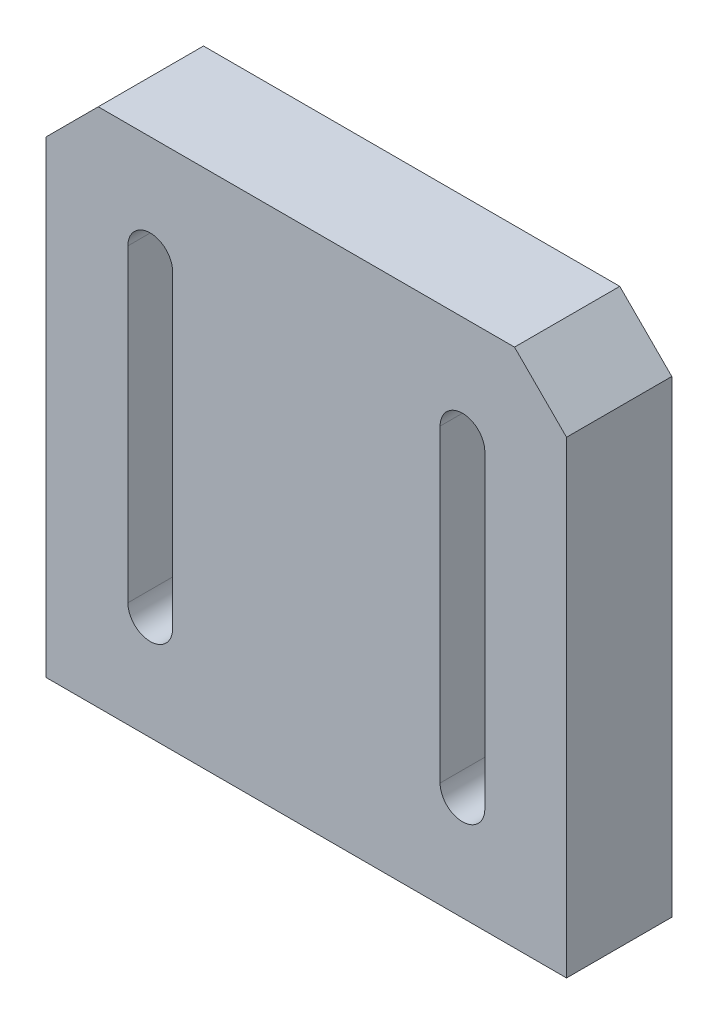
ISO-10303-21;
HEADER;
FILE_DESCRIPTION(('STEP AP214'),'2;1');
FILE_NAME('part.step','',(''),(''),'','','');
FILE_SCHEMA(('AUTOMOTIVE_DESIGN { 1 0 10303 214 1 1 1 1 }'));
ENDSEC;
DATA;
#1=APPLICATION_CONTEXT('core data for automotive mechanical design processes');
#2=APPLICATION_PROTOCOL_DEFINITION('international standard','automotive_design',2000,#1);
#3=PRODUCT_CONTEXT('',#1,'mechanical');
#4=PRODUCT('Part','Part','',(#3));
#5=PRODUCT_RELATED_PRODUCT_CATEGORY('part','',(#4));
#6=PRODUCT_DEFINITION_FORMATION('','',#4);
#7=PRODUCT_DEFINITION_CONTEXT('part definition',#1,'design');
#8=PRODUCT_DEFINITION('design','',#6,#7);
#9=PRODUCT_DEFINITION_SHAPE('','',#8);
#10=(LENGTH_UNIT() NAMED_UNIT(*) SI_UNIT(.MILLI.,.METRE.));
#11=(NAMED_UNIT(*) PLANE_ANGLE_UNIT() SI_UNIT($,.RADIAN.));
#12=(NAMED_UNIT(*) SI_UNIT($,.STERADIAN.) SOLID_ANGLE_UNIT());
#13=UNCERTAINTY_MEASURE_WITH_UNIT(LENGTH_MEASURE(1.E-05),#10,'distance_accuracy_value','');
#14=(GEOMETRIC_REPRESENTATION_CONTEXT(3) GLOBAL_UNCERTAINTY_ASSIGNED_CONTEXT((#13)) GLOBAL_UNIT_ASSIGNED_CONTEXT((#10,
#11,#12)) REPRESENTATION_CONTEXT('',''));
#15=CARTESIAN_POINT('',(0.,0.,0.));
#16=DIRECTION('',(0.,0.,1.));
#17=DIRECTION('',(1.,0.,0.));
#18=AXIS2_PLACEMENT_3D('',#15,#16,#17);
#19=CARTESIAN_POINT('',(0.,25.,0.));
#20=DIRECTION('',(0.,0.,1.));
#21=DIRECTION('',(1.,0.,0.));
#22=AXIS2_PLACEMENT_3D('',#19,#20,#21);
#23=PLANE('',#22);
#24=CARTESIAN_POINT('',(-15.,10.15,0.));
#25=DIRECTION('',(0.,0.,-1.));
#26=DIRECTION('',(-1.,0.,0.));
#27=AXIS2_PLACEMENT_3D('',#24,#25,#26);
#28=CIRCLE('',#27,2.15);
#29=CARTESIAN_POINT('',(-12.85,10.15,0.));
#30=VERTEX_POINT('',#29);
#31=CARTESIAN_POINT('',(-17.15,10.15,0.));
#32=VERTEX_POINT('',#31);
#33=EDGE_CURVE('E209',#30,#32,#28,.T.);
#34=ORIENTED_EDGE('',*,*,#33,.F.);
#35=DIRECTION('',(0.,-1.,0.));
#36=VECTOR('',#35,1.);
#37=CARTESIAN_POINT('',(-12.85,39.85,0.));
#38=LINE('',#37,#36);
#39=CARTESIAN_POINT('',(-12.85,39.85,0.));
#40=VERTEX_POINT('',#39);
#41=EDGE_CURVE('E183',#40,#30,#38,.T.);
#42=ORIENTED_EDGE('',*,*,#41,.F.);
#43=CARTESIAN_POINT('',(-15.,39.85,0.));
#44=DIRECTION('',(0.,0.,-1.));
#45=DIRECTION('',(1.,0.,0.));
#46=AXIS2_PLACEMENT_3D('',#43,#44,#45);
#47=CIRCLE('',#46,2.15);
#48=CARTESIAN_POINT('',(-17.15,39.85,0.));
#49=VERTEX_POINT('',#48);
#50=EDGE_CURVE('E162',#49,#40,#47,.T.);
#51=ORIENTED_EDGE('',*,*,#50,.F.);
#52=DIRECTION('',(0.,1.,0.));
#53=VECTOR('',#52,1.);
#54=CARTESIAN_POINT('',(-17.15,10.15,0.));
#55=LINE('',#54,#53);
#56=EDGE_CURVE('E190',#32,#49,#55,.T.);
#57=ORIENTED_EDGE('',*,*,#56,.F.);
#58=EDGE_LOOP('',(#34,#42,#51,#57));
#59=FACE_BOUND('',#58,.T.);
#60=CARTESIAN_POINT('',(15.,39.85,0.));
#61=DIRECTION('',(0.,0.,-1.));
#62=DIRECTION('',(1.,0.,0.));
#63=AXIS2_PLACEMENT_3D('',#60,#61,#62);
#64=CIRCLE('',#63,2.15);
#65=CARTESIAN_POINT('',(12.85,39.85,0.));
#66=VERTEX_POINT('',#65);
#67=CARTESIAN_POINT('',(17.15,39.85,0.));
#68=VERTEX_POINT('',#67);
#69=EDGE_CURVE('E204',#66,#68,#64,.T.);
#70=ORIENTED_EDGE('',*,*,#69,.F.);
#71=DIRECTION('',(0.,1.,0.));
#72=VECTOR('',#71,1.);
#73=CARTESIAN_POINT('',(12.85,10.15,0.));
#74=LINE('',#73,#72);
#75=CARTESIAN_POINT('',(12.85,10.15,0.));
#76=VERTEX_POINT('',#75);
#77=EDGE_CURVE('E207',#76,#66,#74,.T.);
#78=ORIENTED_EDGE('',*,*,#77,.F.);
#79=CARTESIAN_POINT('',(15.,10.15,0.));
#80=DIRECTION('',(0.,0.,-1.));
#81=DIRECTION('',(-1.,0.,0.));
#82=AXIS2_PLACEMENT_3D('',#79,#80,#81);
#83=CIRCLE('',#82,2.15);
#84=CARTESIAN_POINT('',(17.15,10.15,0.));
#85=VERTEX_POINT('',#84);
#86=EDGE_CURVE('E188',#85,#76,#83,.T.);
#87=ORIENTED_EDGE('',*,*,#86,.F.);
#88=DIRECTION('',(0.,-1.,0.));
#89=VECTOR('',#88,1.);
#90=CARTESIAN_POINT('',(17.15,39.85,0.));
#91=LINE('',#90,#89);
#92=EDGE_CURVE('E220',#68,#85,#91,.T.);
#93=ORIENTED_EDGE('',*,*,#92,.F.);
#94=EDGE_LOOP('',(#70,#78,#87,#93));
#95=FACE_BOUND('',#94,.T.);
#96=DIRECTION('',(-0.707106781186548,0.707106781186548,0.));
#97=VECTOR('',#96,1.);
#98=CARTESIAN_POINT('',(25.,45.,0.));
#99=LINE('',#98,#97);
#100=CARTESIAN_POINT('',(25.,45.,0.));
#101=VERTEX_POINT('',#100);
#102=CARTESIAN_POINT('',(20.,50.,0.));
#103=VERTEX_POINT('',#102);
#104=EDGE_CURVE('E25',#101,#103,#99,.T.);
#105=ORIENTED_EDGE('',*,*,#104,.F.);
#106=DIRECTION('',(0.,1.,0.));
#107=VECTOR('',#106,1.);
#108=CARTESIAN_POINT('',(25.,0.,0.));
#109=LINE('',#108,#107);
#110=CARTESIAN_POINT('',(25.,0.,0.));
#111=VERTEX_POINT('',#110);
#112=EDGE_CURVE('E246',#111,#101,#109,.T.);
#113=ORIENTED_EDGE('',*,*,#112,.F.);
#114=DIRECTION('',(1.,0.,0.));
#115=VECTOR('',#114,1.);
#116=CARTESIAN_POINT('',(-25.,0.,0.));
#117=LINE('',#116,#115);
#118=CARTESIAN_POINT('',(-25.,0.,0.));
#119=VERTEX_POINT('',#118);
#120=EDGE_CURVE('E263',#119,#111,#117,.T.);
#121=ORIENTED_EDGE('',*,*,#120,.F.);
#122=DIRECTION('',(0.,-1.,0.));
#123=VECTOR('',#122,1.);
#124=CARTESIAN_POINT('',(-25.,45.,0.));
#125=LINE('',#124,#123);
#126=CARTESIAN_POINT('',(-25.,45.,0.));
#127=VERTEX_POINT('',#126);
#128=EDGE_CURVE('E272',#127,#119,#125,.T.);
#129=ORIENTED_EDGE('',*,*,#128,.F.);
#130=DIRECTION('',(-0.707106781186548,-0.707106781186548,0.));
#131=VECTOR('',#130,1.);
#132=CARTESIAN_POINT('',(-20.,50.,0.));
#133=LINE('',#132,#131);
#134=CARTESIAN_POINT('',(-20.,50.,0.));
#135=VERTEX_POINT('',#134);
#136=EDGE_CURVE('E281',#135,#127,#133,.T.);
#137=ORIENTED_EDGE('',*,*,#136,.F.);
#138=DIRECTION('',(-1.,0.,0.));
#139=VECTOR('',#138,1.);
#140=CARTESIAN_POINT('',(20.,50.,0.));
#141=LINE('',#140,#139);
#142=EDGE_CURVE('E200',#103,#135,#141,.T.);
#143=ORIENTED_EDGE('',*,*,#142,.F.);
#144=EDGE_LOOP('',(#105,#113,#121,#129,#137,#143));
#145=FACE_BOUND('',#144,.T.);
#146=ADVANCED_FACE('F16',(#59,#95,#145),#23,.F.);
#147=CARTESIAN_POINT('',(0.,25.,10.114));
#148=DIRECTION('',(0.,0.,1.));
#149=DIRECTION('',(1.,0.,0.));
#150=AXIS2_PLACEMENT_3D('',#147,#148,#149);
#151=PLANE('',#150);
#152=CARTESIAN_POINT('',(-15.,10.15,10.114));
#153=DIRECTION('',(0.,0.,-1.));
#154=DIRECTION('',(-1.,0.,0.));
#155=AXIS2_PLACEMENT_3D('',#152,#153,#154);
#156=CIRCLE('',#155,2.15);
#157=CARTESIAN_POINT('',(-12.85,10.15,10.114));
#158=VERTEX_POINT('',#157);
#159=CARTESIAN_POINT('',(-17.15,10.15,10.114));
#160=VERTEX_POINT('',#159);
#161=EDGE_CURVE('E206',#158,#160,#156,.T.);
#162=ORIENTED_EDGE('',*,*,#161,.T.);
#163=DIRECTION('',(0.,1.,0.));
#164=VECTOR('',#163,1.);
#165=CARTESIAN_POINT('',(-17.15,10.15,10.114));
#166=LINE('',#165,#164);
#167=CARTESIAN_POINT('',(-17.15,39.85,10.114));
#168=VERTEX_POINT('',#167);
#169=EDGE_CURVE('E160',#160,#168,#166,.T.);
#170=ORIENTED_EDGE('',*,*,#169,.T.);
#171=CARTESIAN_POINT('',(-15.,39.85,10.114));
#172=DIRECTION('',(0.,0.,-1.));
#173=DIRECTION('',(1.,0.,0.));
#174=AXIS2_PLACEMENT_3D('',#171,#172,#173);
#175=CIRCLE('',#174,2.15);
#176=CARTESIAN_POINT('',(-12.85,39.85,10.114));
#177=VERTEX_POINT('',#176);
#178=EDGE_CURVE('E149',#168,#177,#175,.T.);
#179=ORIENTED_EDGE('',*,*,#178,.T.);
#180=DIRECTION('',(0.,-1.,0.));
#181=VECTOR('',#180,1.);
#182=CARTESIAN_POINT('',(-12.85,39.85,10.114));
#183=LINE('',#182,#181);
#184=EDGE_CURVE('E152',#177,#158,#183,.T.);
#185=ORIENTED_EDGE('',*,*,#184,.T.);
#186=EDGE_LOOP('',(#162,#170,#179,#185));
#187=FACE_BOUND('',#186,.T.);
#188=CARTESIAN_POINT('',(15.,39.85,10.114));
#189=DIRECTION('',(0.,0.,-1.));
#190=DIRECTION('',(1.,0.,0.));
#191=AXIS2_PLACEMENT_3D('',#188,#189,#190);
#192=CIRCLE('',#191,2.15);
#193=CARTESIAN_POINT('',(12.85,39.85,10.114));
#194=VERTEX_POINT('',#193);
#195=CARTESIAN_POINT('',(17.15,39.85,10.114));
#196=VERTEX_POINT('',#195);
#197=EDGE_CURVE('E242',#194,#196,#192,.T.);
#198=ORIENTED_EDGE('',*,*,#197,.T.);
#199=DIRECTION('',(0.,-1.,0.));
#200=VECTOR('',#199,1.);
#201=CARTESIAN_POINT('',(17.15,39.85,10.114));
#202=LINE('',#201,#200);
#203=CARTESIAN_POINT('',(17.15,10.15,10.114));
#204=VERTEX_POINT('',#203);
#205=EDGE_CURVE('E202',#196,#204,#202,.T.);
#206=ORIENTED_EDGE('',*,*,#205,.T.);
#207=CARTESIAN_POINT('',(15.,10.15,10.114));
#208=DIRECTION('',(0.,0.,-1.));
#209=DIRECTION('',(-1.,0.,0.));
#210=AXIS2_PLACEMENT_3D('',#207,#208,#209);
#211=CIRCLE('',#210,2.15);
#212=CARTESIAN_POINT('',(12.85,10.15,10.114));
#213=VERTEX_POINT('',#212);
#214=EDGE_CURVE('E189',#204,#213,#211,.T.);
#215=ORIENTED_EDGE('',*,*,#214,.T.);
#216=DIRECTION('',(0.,1.,0.));
#217=VECTOR('',#216,1.);
#218=CARTESIAN_POINT('',(12.85,10.15,10.114));
#219=LINE('',#218,#217);
#220=EDGE_CURVE('E240',#213,#194,#219,.T.);
#221=ORIENTED_EDGE('',*,*,#220,.T.);
#222=EDGE_LOOP('',(#198,#206,#215,#221));
#223=FACE_BOUND('',#222,.T.);
#224=DIRECTION('',(-0.707106781186548,0.707106781186548,0.));
#225=VECTOR('',#224,1.);
#226=CARTESIAN_POINT('',(25.,45.,10.114));
#227=LINE('',#226,#225);
#228=CARTESIAN_POINT('',(25.,45.,10.114));
#229=VERTEX_POINT('',#228);
#230=CARTESIAN_POINT('',(20.,50.,10.114));
#231=VERTEX_POINT('',#230);
#232=EDGE_CURVE('E11',#229,#231,#227,.T.);
#233=ORIENTED_EDGE('',*,*,#232,.T.);
#234=DIRECTION('',(-1.,0.,0.));
#235=VECTOR('',#234,1.);
#236=CARTESIAN_POINT('',(20.,50.,10.114));
#237=LINE('',#236,#235);
#238=CARTESIAN_POINT('',(-20.,50.,10.114));
#239=VERTEX_POINT('',#238);
#240=EDGE_CURVE('E194',#231,#239,#237,.T.);
#241=ORIENTED_EDGE('',*,*,#240,.T.);
#242=DIRECTION('',(-0.707106781186548,-0.707106781186548,0.));
#243=VECTOR('',#242,1.);
#244=CARTESIAN_POINT('',(-20.,50.,10.114));
#245=LINE('',#244,#243);
#246=CARTESIAN_POINT('',(-25.,45.,10.114));
#247=VERTEX_POINT('',#246);
#248=EDGE_CURVE('E283',#239,#247,#245,.T.);
#249=ORIENTED_EDGE('',*,*,#248,.T.);
#250=DIRECTION('',(0.,-1.,0.));
#251=VECTOR('',#250,1.);
#252=CARTESIAN_POINT('',(-25.,45.,10.114));
#253=LINE('',#252,#251);
#254=CARTESIAN_POINT('',(-25.,0.,10.114));
#255=VERTEX_POINT('',#254);
#256=EDGE_CURVE('E273',#247,#255,#253,.T.);
#257=ORIENTED_EDGE('',*,*,#256,.T.);
#258=DIRECTION('',(1.,0.,0.));
#259=VECTOR('',#258,1.);
#260=CARTESIAN_POINT('',(-25.,0.,10.114));
#261=LINE('',#260,#259);
#262=CARTESIAN_POINT('',(25.,0.,10.114));
#263=VERTEX_POINT('',#262);
#264=EDGE_CURVE('E266',#255,#263,#261,.T.);
#265=ORIENTED_EDGE('',*,*,#264,.T.);
#266=DIRECTION('',(0.,1.,0.));
#267=VECTOR('',#266,1.);
#268=CARTESIAN_POINT('',(25.,0.,10.114));
#269=LINE('',#268,#267);
#270=EDGE_CURVE('E258',#263,#229,#269,.T.);
#271=ORIENTED_EDGE('',*,*,#270,.T.);
#272=EDGE_LOOP('',(#233,#241,#249,#257,#265,#271));
#273=FACE_BOUND('',#272,.T.);
#274=ADVANCED_FACE('F151',(#187,#223,#273),#151,.T.);
#275=CARTESIAN_POINT('',(25.,45.,0.));
#276=DIRECTION('',(0.707106781186548,0.707106781186548,0.));
#277=DIRECTION('',(0.,0.,-1.));
#278=AXIS2_PLACEMENT_3D('',#275,#276,#277);
#279=PLANE('',#278);
#280=ORIENTED_EDGE('',*,*,#104,.T.);
#281=DIRECTION('',(0.,0.,1.));
#282=VECTOR('',#281,1.);
#283=CARTESIAN_POINT('',(20.,50.,0.));
#284=LINE('',#283,#282);
#285=EDGE_CURVE('E196',#103,#231,#284,.T.);
#286=ORIENTED_EDGE('',*,*,#285,.T.);
#287=ORIENTED_EDGE('',*,*,#232,.F.);
#288=DIRECTION('',(0.,0.,1.));
#289=VECTOR('',#288,1.);
#290=CARTESIAN_POINT('',(25.,45.,0.));
#291=LINE('',#290,#289);
#292=EDGE_CURVE('E252',#101,#229,#291,.T.);
#293=ORIENTED_EDGE('',*,*,#292,.F.);
#294=EDGE_LOOP('',(#280,#286,#287,#293));
#295=FACE_BOUND('',#294,.T.);
#296=ADVANCED_FACE('F291',(#295),#279,.T.);
#297=CARTESIAN_POINT('',(20.,50.,0.));
#298=DIRECTION('',(0.,1.,0.));
#299=DIRECTION('',(1.,0.,0.));
#300=AXIS2_PLACEMENT_3D('',#297,#298,#299);
#301=PLANE('',#300);
#302=ORIENTED_EDGE('',*,*,#142,.T.);
#303=DIRECTION('',(0.,0.,1.));
#304=VECTOR('',#303,1.);
#305=CARTESIAN_POINT('',(-20.,50.,0.));
#306=LINE('',#305,#304);
#307=EDGE_CURVE('E223',#135,#239,#306,.T.);
#308=ORIENTED_EDGE('',*,*,#307,.T.);
#309=ORIENTED_EDGE('',*,*,#240,.F.);
#310=ORIENTED_EDGE('',*,*,#285,.F.);
#311=EDGE_LOOP('',(#302,#308,#309,#310));
#312=FACE_BOUND('',#311,.T.);
#313=ADVANCED_FACE('F294',(#312),#301,.T.);
#314=CARTESIAN_POINT('',(-20.,50.,0.));
#315=DIRECTION('',(-0.707106781186548,0.707106781186548,0.));
#316=DIRECTION('',(0.,0.,1.));
#317=AXIS2_PLACEMENT_3D('',#314,#315,#316);
#318=PLANE('',#317);
#319=ORIENTED_EDGE('',*,*,#136,.T.);
#320=DIRECTION('',(0.,0.,1.));
#321=VECTOR('',#320,1.);
#322=CARTESIAN_POINT('',(-25.,45.,0.));
#323=LINE('',#322,#321);
#324=EDGE_CURVE('E280',#127,#247,#323,.T.);
#325=ORIENTED_EDGE('',*,*,#324,.T.);
#326=ORIENTED_EDGE('',*,*,#248,.F.);
#327=ORIENTED_EDGE('',*,*,#307,.F.);
#328=EDGE_LOOP('',(#319,#325,#326,#327));
#329=FACE_BOUND('',#328,.T.);
#330=ADVANCED_FACE('F18',(#329),#318,.T.);
#331=CARTESIAN_POINT('',(-25.,45.,0.));
#332=DIRECTION('',(-1.,0.,0.));
#333=DIRECTION('',(0.,0.,1.));
#334=AXIS2_PLACEMENT_3D('',#331,#332,#333);
#335=PLANE('',#334);
#336=ORIENTED_EDGE('',*,*,#128,.T.);
#337=DIRECTION('',(0.,0.,1.));
#338=VECTOR('',#337,1.);
#339=CARTESIAN_POINT('',(-25.,0.,0.));
#340=LINE('',#339,#338);
#341=EDGE_CURVE('E267',#119,#255,#340,.T.);
#342=ORIENTED_EDGE('',*,*,#341,.T.);
#343=ORIENTED_EDGE('',*,*,#256,.F.);
#344=ORIENTED_EDGE('',*,*,#324,.F.);
#345=EDGE_LOOP('',(#336,#342,#343,#344));
#346=FACE_BOUND('',#345,.T.);
#347=ADVANCED_FACE('F302',(#346),#335,.T.);
#348=CARTESIAN_POINT('',(-25.,0.,0.));
#349=DIRECTION('',(0.,-1.,0.));
#350=DIRECTION('',(0.,0.,-1.));
#351=AXIS2_PLACEMENT_3D('',#348,#349,#350);
#352=PLANE('',#351);
#353=ORIENTED_EDGE('',*,*,#120,.T.);
#354=DIRECTION('',(0.,0.,1.));
#355=VECTOR('',#354,1.);
#356=CARTESIAN_POINT('',(25.,0.,0.));
#357=LINE('',#356,#355);
#358=EDGE_CURVE('E259',#111,#263,#357,.T.);
#359=ORIENTED_EDGE('',*,*,#358,.T.);
#360=ORIENTED_EDGE('',*,*,#264,.F.);
#361=ORIENTED_EDGE('',*,*,#341,.F.);
#362=EDGE_LOOP('',(#353,#359,#360,#361));
#363=FACE_BOUND('',#362,.T.);
#364=ADVANCED_FACE('F310',(#363),#352,.T.);
#365=CARTESIAN_POINT('',(25.,0.,0.));
#366=DIRECTION('',(1.,0.,0.));
#367=DIRECTION('',(0.,1.,0.));
#368=AXIS2_PLACEMENT_3D('',#365,#366,#367);
#369=PLANE('',#368);
#370=ORIENTED_EDGE('',*,*,#112,.T.);
#371=ORIENTED_EDGE('',*,*,#292,.T.);
#372=ORIENTED_EDGE('',*,*,#270,.F.);
#373=ORIENTED_EDGE('',*,*,#358,.F.);
#374=EDGE_LOOP('',(#370,#371,#372,#373));
#375=FACE_BOUND('',#374,.T.);
#376=ADVANCED_FACE('F311',(#375),#369,.T.);
#377=CARTESIAN_POINT('',(15.,39.85,0.));
#378=DIRECTION('',(0.,0.,1.));
#379=DIRECTION('',(1.,0.,0.));
#380=AXIS2_PLACEMENT_3D('',#377,#378,#379);
#381=CYLINDRICAL_SURFACE('',#380,2.15);
#382=ORIENTED_EDGE('',*,*,#69,.T.);
#383=DIRECTION('',(0.,0.,1.));
#384=VECTOR('',#383,1.);
#385=CARTESIAN_POINT('',(17.15,39.85,0.));
#386=LINE('',#385,#384);
#387=EDGE_CURVE('E199',#68,#196,#386,.T.);
#388=ORIENTED_EDGE('',*,*,#387,.T.);
#389=ORIENTED_EDGE('',*,*,#197,.F.);
#390=DIRECTION('',(0.,0.,1.));
#391=VECTOR('',#390,1.);
#392=CARTESIAN_POINT('',(12.85,39.85,0.));
#393=LINE('',#392,#391);
#394=EDGE_CURVE('E235',#66,#194,#393,.T.);
#395=ORIENTED_EDGE('',*,*,#394,.F.);
#396=EDGE_LOOP('',(#382,#388,#389,#395));
#397=FACE_BOUND('',#396,.T.);
#398=ADVANCED_FACE('F350',(#397),#381,.F.);
#399=CARTESIAN_POINT('',(17.15,39.85,0.));
#400=DIRECTION('',(-1.,0.,0.));
#401=DIRECTION('',(0.,0.,1.));
#402=AXIS2_PLACEMENT_3D('',#399,#400,#401);
#403=PLANE('',#402);
#404=ORIENTED_EDGE('',*,*,#92,.T.);
#405=DIRECTION('',(0.,0.,1.));
#406=VECTOR('',#405,1.);
#407=CARTESIAN_POINT('',(17.15,10.15,0.));
#408=LINE('',#407,#406);
#409=EDGE_CURVE('E212',#85,#204,#408,.T.);
#410=ORIENTED_EDGE('',*,*,#409,.T.);
#411=ORIENTED_EDGE('',*,*,#205,.F.);
#412=ORIENTED_EDGE('',*,*,#387,.F.);
#413=EDGE_LOOP('',(#404,#410,#411,#412));
#414=FACE_BOUND('',#413,.T.);
#415=ADVANCED_FACE('F355',(#414),#403,.T.);
#416=CARTESIAN_POINT('',(15.,10.15,0.));
#417=DIRECTION('',(0.,0.,1.));
#418=DIRECTION('',(-1.,0.,0.));
#419=AXIS2_PLACEMENT_3D('',#416,#417,#418);
#420=CYLINDRICAL_SURFACE('',#419,2.15);
#421=ORIENTED_EDGE('',*,*,#86,.T.);
#422=DIRECTION('',(0.,0.,1.));
#423=VECTOR('',#422,1.);
#424=CARTESIAN_POINT('',(12.85,10.15,0.));
#425=LINE('',#424,#423);
#426=EDGE_CURVE('E191',#76,#213,#425,.T.);
#427=ORIENTED_EDGE('',*,*,#426,.T.);
#428=ORIENTED_EDGE('',*,*,#214,.F.);
#429=ORIENTED_EDGE('',*,*,#409,.F.);
#430=EDGE_LOOP('',(#421,#427,#428,#429));
#431=FACE_BOUND('',#430,.T.);
#432=ADVANCED_FACE('F356',(#431),#420,.F.);
#433=CARTESIAN_POINT('',(12.85,10.15,0.));
#434=DIRECTION('',(1.,0.,0.));
#435=DIRECTION('',(0.,1.,0.));
#436=AXIS2_PLACEMENT_3D('',#433,#434,#435);
#437=PLANE('',#436);
#438=ORIENTED_EDGE('',*,*,#77,.T.);
#439=ORIENTED_EDGE('',*,*,#394,.T.);
#440=ORIENTED_EDGE('',*,*,#220,.F.);
#441=ORIENTED_EDGE('',*,*,#426,.F.);
#442=EDGE_LOOP('',(#438,#439,#440,#441));
#443=FACE_BOUND('',#442,.T.);
#444=ADVANCED_FACE('F345',(#443),#437,.T.);
#445=CARTESIAN_POINT('',(-15.,10.15,0.));
#446=DIRECTION('',(0.,0.,1.));
#447=DIRECTION('',(-1.,0.,0.));
#448=AXIS2_PLACEMENT_3D('',#445,#446,#447);
#449=CYLINDRICAL_SURFACE('',#448,2.15);
#450=ORIENTED_EDGE('',*,*,#33,.T.);
#451=DIRECTION('',(0.,0.,1.));
#452=VECTOR('',#451,1.);
#453=CARTESIAN_POINT('',(-17.15,10.15,0.));
#454=LINE('',#453,#452);
#455=EDGE_CURVE('E213',#32,#160,#454,.T.);
#456=ORIENTED_EDGE('',*,*,#455,.T.);
#457=ORIENTED_EDGE('',*,*,#161,.F.);
#458=DIRECTION('',(0.,0.,1.));
#459=VECTOR('',#458,1.);
#460=CARTESIAN_POINT('',(-12.85,10.15,0.));
#461=LINE('',#460,#459);
#462=EDGE_CURVE('E176',#30,#158,#461,.T.);
#463=ORIENTED_EDGE('',*,*,#462,.F.);
#464=EDGE_LOOP('',(#450,#456,#457,#463));
#465=FACE_BOUND('',#464,.T.);
#466=ADVANCED_FACE('F375',(#465),#449,.F.);
#467=CARTESIAN_POINT('',(-17.15,10.15,0.));
#468=DIRECTION('',(1.,0.,0.));
#469=DIRECTION('',(0.,1.,0.));
#470=AXIS2_PLACEMENT_3D('',#467,#468,#469);
#471=PLANE('',#470);
#472=ORIENTED_EDGE('',*,*,#56,.T.);
#473=DIRECTION('',(0.,0.,1.));
#474=VECTOR('',#473,1.);
#475=CARTESIAN_POINT('',(-17.15,39.85,0.));
#476=LINE('',#475,#474);
#477=EDGE_CURVE('E165',#49,#168,#476,.T.);
#478=ORIENTED_EDGE('',*,*,#477,.T.);
#479=ORIENTED_EDGE('',*,*,#169,.F.);
#480=ORIENTED_EDGE('',*,*,#455,.F.);
#481=EDGE_LOOP('',(#472,#478,#479,#480));
#482=FACE_BOUND('',#481,.T.);
#483=ADVANCED_FACE('F327',(#482),#471,.T.);
#484=CARTESIAN_POINT('',(-15.,39.85,0.));
#485=DIRECTION('',(0.,0.,1.));
#486=DIRECTION('',(1.,0.,0.));
#487=AXIS2_PLACEMENT_3D('',#484,#485,#486);
#488=CYLINDRICAL_SURFACE('',#487,2.15);
#489=ORIENTED_EDGE('',*,*,#50,.T.);
#490=DIRECTION('',(0.,0.,1.));
#491=VECTOR('',#490,1.);
#492=CARTESIAN_POINT('',(-12.85,39.85,0.));
#493=LINE('',#492,#491);
#494=EDGE_CURVE('E167',#40,#177,#493,.T.);
#495=ORIENTED_EDGE('',*,*,#494,.T.);
#496=ORIENTED_EDGE('',*,*,#178,.F.);
#497=ORIENTED_EDGE('',*,*,#477,.F.);
#498=EDGE_LOOP('',(#489,#495,#496,#497));
#499=FACE_BOUND('',#498,.T.);
#500=ADVANCED_FACE('F170',(#499),#488,.F.);
#501=CARTESIAN_POINT('',(-12.85,39.85,0.));
#502=DIRECTION('',(-1.,0.,0.));
#503=DIRECTION('',(0.,0.,1.));
#504=AXIS2_PLACEMENT_3D('',#501,#502,#503);
#505=PLANE('',#504);
#506=ORIENTED_EDGE('',*,*,#41,.T.);
#507=ORIENTED_EDGE('',*,*,#462,.T.);
#508=ORIENTED_EDGE('',*,*,#184,.F.);
#509=ORIENTED_EDGE('',*,*,#494,.F.);
#510=EDGE_LOOP('',(#506,#507,#508,#509));
#511=FACE_BOUND('',#510,.T.);
#512=ADVANCED_FACE('F173',(#511),#505,.T.);
#513=CLOSED_SHELL('',(#146,#274,#296,#313,#330,#347,#364,#376,#398,#415,#432,#444,#466,#483,
#500,#512));
#514=MANIFOLD_SOLID_BREP('B1',#513);
#515=ADVANCED_BREP_SHAPE_REPRESENTATION('',(#18,#514),#14);
#516=SHAPE_DEFINITION_REPRESENTATION(#9,#515);
ENDSEC;
END-ISO-10303-21;
